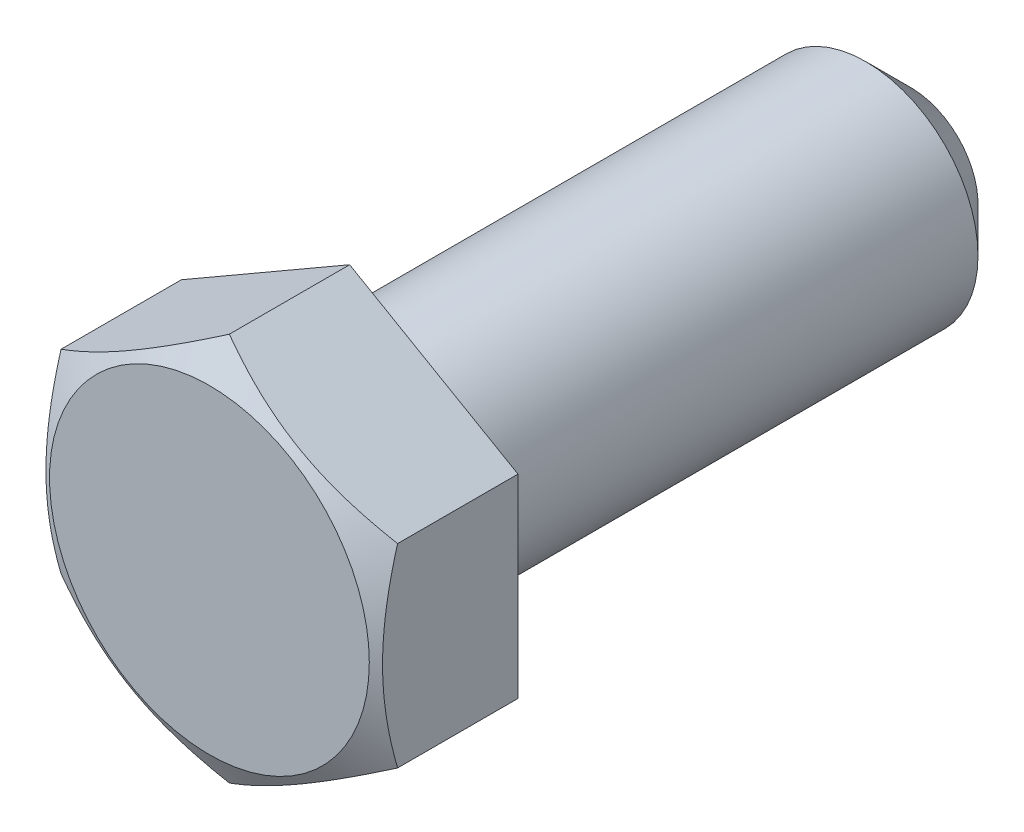
ISO-10303-21;
HEADER;
FILE_DESCRIPTION(('STEP AP214'),'2;1');
FILE_NAME('part.step','',(''),(''),'','','');
FILE_SCHEMA(('AUTOMOTIVE_DESIGN { 1 0 10303 214 1 1 1 1 }'));
ENDSEC;
DATA;
#1=APPLICATION_CONTEXT('core data for automotive mechanical design processes');
#2=APPLICATION_PROTOCOL_DEFINITION('international standard','automotive_design',2000,#1);
#3=PRODUCT_CONTEXT('',#1,'mechanical');
#4=PRODUCT('Part','Part','',(#3));
#5=PRODUCT_RELATED_PRODUCT_CATEGORY('part','',(#4));
#6=PRODUCT_DEFINITION_FORMATION('','',#4);
#7=PRODUCT_DEFINITION_CONTEXT('part definition',#1,'design');
#8=PRODUCT_DEFINITION('design','',#6,#7);
#9=PRODUCT_DEFINITION_SHAPE('','',#8);
#10=(LENGTH_UNIT() NAMED_UNIT(*) SI_UNIT(.MILLI.,.METRE.));
#11=(NAMED_UNIT(*) PLANE_ANGLE_UNIT() SI_UNIT($,.RADIAN.));
#12=(NAMED_UNIT(*) SI_UNIT($,.STERADIAN.) SOLID_ANGLE_UNIT());
#13=UNCERTAINTY_MEASURE_WITH_UNIT(LENGTH_MEASURE(1.E-05),#10,'distance_accuracy_value','');
#14=(GEOMETRIC_REPRESENTATION_CONTEXT(3) GLOBAL_UNCERTAINTY_ASSIGNED_CONTEXT((#13)) GLOBAL_UNIT_ASSIGNED_CONTEXT((#10,
#11,#12)) REPRESENTATION_CONTEXT('',''));
#15=CARTESIAN_POINT('',(0.,0.,0.));
#16=DIRECTION('',(0.,0.,1.));
#17=DIRECTION('',(1.,0.,0.));
#18=AXIS2_PLACEMENT_3D('',#15,#16,#17);
#19=CARTESIAN_POINT('',(-5.99999999999998,-3.46410161513775,5.));
#20=DIRECTION('',(0.5,0.866025403784439,0.));
#21=DIRECTION('',(-0.866025403784439,0.5,0.));
#22=AXIS2_PLACEMENT_3D('',#19,#20,#21);
#23=PLANE('',#22);
#24=CARTESIAN_POINT('',(-6.00019999999998,-3.46398614508391,4.29082986604757));
#25=CARTESIAN_POINT('',(-5.86831298517511,-3.54013114859567,4.3347859201272));
#26=CARTESIAN_POINT('',(-5.73593423148341,-3.61656005767456,4.37674711202273));
#27=CARTESIAN_POINT('',(-5.47010166371691,-3.77003856223392,4.45613034244834));
#28=CARTESIAN_POINT('',(-5.33664741215047,-3.8470884103003,4.49355042284748));
#29=CARTESIAN_POINT('',(-4.93414786853866,-4.07947163015328,4.59826450915695));
#30=CARTESIAN_POINT('',(-4.66351376704061,-4.23572230150507,4.65782486186122));
#31=CARTESIAN_POINT('',(-4.25851475367193,-4.46954859089501,4.72766670852789));
#32=CARTESIAN_POINT('',(-4.12535995126211,-4.54642555191021,4.7475626911913));
#33=CARTESIAN_POINT('',(-3.85844867807932,-4.70052684733204,4.78092550444416));
#34=CARTESIAN_POINT('',(-3.72469226152165,-4.77775115043745,4.79439290308425));
#35=CARTESIAN_POINT('',(-3.45694711123092,-4.93233388503202,4.81455532749276));
#36=CARTESIAN_POINT('',(-3.32295881481366,-5.00969206403678,4.82125803924327));
#37=CARTESIAN_POINT('',(-3.05486583404941,-5.16447561864887,4.827754555833));
#38=CARTESIAN_POINT('',(-2.92076115342572,-5.24190099210655,4.82754857409505));
#39=CARTESIAN_POINT('',(-2.55335498732316,-5.45402304100779,4.81748773401741));
#40=CARTESIAN_POINT('',(-2.32017376082349,-5.58865028489734,4.80059702624085));
#41=CARTESIAN_POINT('',(-1.85536008360595,-5.85701058656191,4.74703569645255));
#42=CARTESIAN_POINT('',(-1.62372926764809,-5.99074270050779,4.71034676627936));
#43=CARTESIAN_POINT('',(-1.15798010064802,-6.25964310745013,4.61863479254742));
#44=CARTESIAN_POINT('',(-0.923920520434874,-6.3947774690926,4.56322316253247));
#45=CARTESIAN_POINT('',(-0.459291913470387,-6.66303092039674,4.43746100605974));
#46=CARTESIAN_POINT('',(-0.228716936044308,-6.79615344568208,4.36714002192695));
#47=CARTESIAN_POINT('',(0.000200000000001147,-6.92831870032933,4.29082986604758));
#48=B_SPLINE_CURVE_WITH_KNOTS('',3,(#24,#25,#26,#27,#28,#29,#30,#31,#32,#33,#34,#35,#36,#37,#38,
#39,#40,#41,#42,#43,#44,#45,#46,#47),.UNSPECIFIED.,.F.,.F.,(4,2,2,2,2,2,2,2,2,2,2,4),(0.,
0.475482194578525,0.951168694392475,1.90451835622161,2.36951738073402,2.83447530880776,
3.29890435872166,3.76331906154277,4.57182194271093,5.38107376137306,6.20827406017202,
7.03385036012982),.UNSPECIFIED.);
#49=CARTESIAN_POINT('',(-5.99999999999998,-3.46410161513813,4.29089653438113));
#50=VERTEX_POINT('',#49);
#51=CARTESIAN_POINT('',(0.,-6.92820323027549,4.29089653438088));
#52=VERTEX_POINT('',#51);
#53=EDGE_CURVE('E98',#50,#52,#48,.T.);
#54=ORIENTED_EDGE('',*,*,#53,.F.);
#55=DIRECTION('',(0.,0.,-1.));
#56=VECTOR('',#55,1.);
#57=CARTESIAN_POINT('',(-5.99999999999998,-3.46410161513775,5.));
#58=LINE('',#57,#56);
#59=CARTESIAN_POINT('',(-5.99999999999998,-3.46410161513775,0.));
#60=VERTEX_POINT('',#59);
#61=EDGE_CURVE('E67',#50,#60,#58,.T.);
#62=ORIENTED_EDGE('',*,*,#61,.T.);
#63=DIRECTION('',(0.866025403784439,-0.5,0.));
#64=VECTOR('',#63,1.);
#65=CARTESIAN_POINT('',(-5.99999999999998,-3.46410161513775,0.));
#66=LINE('',#65,#64);
#67=CARTESIAN_POINT('',(0.,-6.92820323027549,0.));
#68=VERTEX_POINT('',#67);
#69=EDGE_CURVE('E106',#60,#68,#66,.T.);
#70=ORIENTED_EDGE('',*,*,#69,.T.);
#71=DIRECTION('',(0.,0.,-1.));
#72=VECTOR('',#71,1.);
#73=CARTESIAN_POINT('',(0.,-6.92820323027549,5.));
#74=LINE('',#73,#72);
#75=EDGE_CURVE('E105',#52,#68,#74,.T.);
#76=ORIENTED_EDGE('',*,*,#75,.F.);
#77=EDGE_LOOP('',(#54,#62,#70,#76));
#78=FACE_BOUND('',#77,.T.);
#79=ADVANCED_FACE('F44',(#78),#23,.F.);
#80=CARTESIAN_POINT('',(0.,-6.92820323027549,5.));
#81=DIRECTION('',(-0.5,0.866025403784439,0.));
#82=DIRECTION('',(-0.866025403784439,-0.5,0.));
#83=AXIS2_PLACEMENT_3D('',#80,#81,#82);
#84=PLANE('',#83);
#85=CARTESIAN_POINT('',(-0.000199999999999171,-6.92831870032933,4.29082986604758));
#86=CARTESIAN_POINT('',(0.131687014824876,-6.85217369681757,4.3347859201272));
#87=CARTESIAN_POINT('',(0.264065768516574,-6.77574478773868,4.37674711202273));
#88=CARTESIAN_POINT('',(0.529898336283079,-6.62226628317932,4.45613034244834));
#89=CARTESIAN_POINT('',(0.66335258784951,-6.54521643511294,4.49355042284748));
#90=CARTESIAN_POINT('',(1.06585213146133,-6.31283321525996,4.59826450915695));
#91=CARTESIAN_POINT('',(1.33648623295937,-6.15658254390817,4.65782486186122));
#92=CARTESIAN_POINT('',(1.74148524632806,-5.92275625451822,4.72766670852789));
#93=CARTESIAN_POINT('',(1.87464004873787,-5.84587929350303,4.7475626911913));
#94=CARTESIAN_POINT('',(2.14155132192066,-5.6917779980812,4.78092550444416));
#95=CARTESIAN_POINT('',(2.27530773847834,-5.61455369497578,4.79439290308425));
#96=CARTESIAN_POINT('',(2.54305288876907,-5.45997096038121,4.81455532749276));
#97=CARTESIAN_POINT('',(2.67704118518632,-5.38261278137645,4.82125803924327));
#98=CARTESIAN_POINT('',(2.94513416595058,-5.22782922676436,4.827754555833));
#99=CARTESIAN_POINT('',(3.07923884657426,-5.15040385330669,4.82754857409505));
#100=CARTESIAN_POINT('',(3.44664501267682,-4.93828180440545,4.81748773401741));
#101=CARTESIAN_POINT('',(3.67982623917649,-4.80365456051589,4.80059702624085));
#102=CARTESIAN_POINT('',(4.14463991639403,-4.53529425885133,4.74703569645255));
#103=CARTESIAN_POINT('',(4.37627073235189,-4.40156214490545,4.71034676627937));
#104=CARTESIAN_POINT('',(4.84201989935196,-4.13266173796311,4.61863479254742));
#105=CARTESIAN_POINT('',(5.07607947956511,-3.99752737632064,4.56322316253247));
#106=CARTESIAN_POINT('',(5.5407080865296,-3.72927392501649,4.43746100605974));
#107=CARTESIAN_POINT('',(5.77128306395568,-3.59615139973115,4.36714002192695));
#108=CARTESIAN_POINT('',(6.00019999999999,-3.46398614508391,4.29082986604758));
#109=B_SPLINE_CURVE_WITH_KNOTS('',3,(#85,#86,#87,#88,#89,#90,#91,#92,#93,#94,#95,#96,#97,#98,
#99,#100,#101,#102,#103,#104,#105,#106,#107,#108),.UNSPECIFIED.,.F.,.F.,(4,2,2,2,2,2,2,2,2,2,2,
4),(0.,0.475482194578524,0.951168694392474,1.90451835622161,2.36951738073402,2.83447530880775,
3.29890435872166,3.76331906154277,4.57182194271093,5.38107376137306,6.20827406017202,
7.03385036012982),.UNSPECIFIED.);
#110=CARTESIAN_POINT('',(5.99999999999999,-3.46410161513812,4.29089653438113));
#111=VERTEX_POINT('',#110);
#112=EDGE_CURVE('E107',#52,#111,#109,.T.);
#113=ORIENTED_EDGE('',*,*,#112,.F.);
#114=ORIENTED_EDGE('',*,*,#75,.T.);
#115=DIRECTION('',(0.866025403784439,0.5,0.));
#116=VECTOR('',#115,1.);
#117=CARTESIAN_POINT('',(0.,-6.92820323027549,0.));
#118=LINE('',#117,#116);
#119=CARTESIAN_POINT('',(5.99999999999999,-3.46410161513774,0.));
#120=VERTEX_POINT('',#119);
#121=EDGE_CURVE('E227',#68,#120,#118,.T.);
#122=ORIENTED_EDGE('',*,*,#121,.T.);
#123=DIRECTION('',(0.,0.,-1.));
#124=VECTOR('',#123,1.);
#125=CARTESIAN_POINT('',(5.99999999999999,-3.46410161513774,5.));
#126=LINE('',#125,#124);
#127=EDGE_CURVE('E124',#111,#120,#126,.T.);
#128=ORIENTED_EDGE('',*,*,#127,.F.);
#129=EDGE_LOOP('',(#113,#114,#122,#128));
#130=FACE_BOUND('',#129,.T.);
#131=ADVANCED_FACE('F140',(#130),#84,.F.);
#132=CARTESIAN_POINT('',(5.99999999999999,-3.46410161513774,5.));
#133=DIRECTION('',(-1.,0.,0.));
#134=DIRECTION('',(0.,-1.,0.));
#135=AXIS2_PLACEMENT_3D('',#132,#133,#134);
#136=PLANE('',#135);
#137=CARTESIAN_POINT('',(5.99999999999999,-9.41358703731059,1.84585655754542));
#138=CARTESIAN_POINT('',(5.99999999999999,-9.15055363254466,1.97388419446467));
#139=CARTESIAN_POINT('',(5.99999999999999,-8.88692786426045,2.10071510757524));
#140=CARTESIAN_POINT('',(5.99999999999999,-8.35817691182027,2.35131238753976));
#141=CARTESIAN_POINT('',(5.99999999999999,-8.09305150854343,2.47507829155208));
#142=CARTESIAN_POINT('',(5.99999999999999,-7.55967250710022,2.719473830938));
#143=CARTESIAN_POINT('',(5.99999999999999,-7.29140979810816,2.84008364922646));
#144=CARTESIAN_POINT('',(5.99999999999999,-6.7527878549826,3.07650919140131));
#145=CARTESIAN_POINT('',(5.99999999999999,-6.48242871758445,3.19232513494651));
#146=CARTESIAN_POINT('',(5.99999999999999,-5.93014019572464,3.42165597190256));
#147=CARTESIAN_POINT('',(5.99999999999999,-5.64812525483188,3.53496591554263));
#148=CARTESIAN_POINT('',(5.99999999999999,-5.08083631614906,3.75326995147352));
#149=CARTESIAN_POINT('',(5.99999999999999,-4.79556196274389,3.85826312626367));
#150=CARTESIAN_POINT('',(5.99999999999999,-4.22180070425094,4.05725759327078));
#151=CARTESIAN_POINT('',(5.99999999999999,-3.93332126545669,4.15128020625535));
#152=CARTESIAN_POINT('',(5.99999999999999,-3.3522227716447,4.32538790187895));
#153=CARTESIAN_POINT('',(5.99999999999999,-3.05960501611013,4.40547725908282));
#154=CARTESIAN_POINT('',(5.99999999999999,-2.4716777749085,4.54753070608564));
#155=CARTESIAN_POINT('',(5.99999999999999,-2.17639270662995,4.60959426766009));
#156=CARTESIAN_POINT('',(5.99999999999999,-1.58199809200649,4.71213678804348));
#157=CARTESIAN_POINT('',(5.99999999999998,-1.28288895916409,4.75261806070266));
#158=CARTESIAN_POINT('',(5.99999999999998,-0.834541803091241,4.79447047014564));
#159=CARTESIAN_POINT('',(5.99999999999998,-0.686147782785073,4.80526549063764));
#160=CARTESIAN_POINT('',(5.99999999999998,-0.389029437098239,4.82057075314271));
#161=CARTESIAN_POINT('',(5.99999999999998,-0.240305117413913,4.82508110271098));
#162=CARTESIAN_POINT('',(5.99999999999998,0.0572007852977071,4.82770224372379));
#163=CARTESIAN_POINT('',(5.99999999999998,0.205982368818301,4.82581297874654));
#164=CARTESIAN_POINT('',(5.99999999999998,0.503331383534949,4.81568408291935));
#165=CARTESIAN_POINT('',(5.99999999999998,0.651898804391681,4.8074441551235));
#166=CARTESIAN_POINT('',(5.99999999999998,1.00563279304975,4.78044117795031));
#167=CARTESIAN_POINT('',(5.99999999999998,1.21058824349711,4.75884951042692));
#168=CARTESIAN_POINT('',(5.99999999999998,1.61903955566245,4.70473232545167));
#169=CARTESIAN_POINT('',(5.99999999999998,1.82253522833311,4.67220541704672));
#170=CARTESIAN_POINT('',(5.99999999999998,2.43055789508273,4.55994161397375));
#171=CARTESIAN_POINT('',(5.99999999999998,2.8324163737843,4.46553934429469));
#172=CARTESIAN_POINT('',(5.99999999999998,3.4336102171109,4.30101298168707));
#173=CARTESIAN_POINT('',(5.99999999999998,3.63603903116757,4.24153593737795));
#174=CARTESIAN_POINT('',(5.99999999999998,4.03893185407426,4.11620342515447));
#175=CARTESIAN_POINT('',(5.99999999999998,4.23939584781033,4.0503479082174));
#176=CARTESIAN_POINT('',(5.99999999999998,4.63842099133087,3.91333183578959));
#177=CARTESIAN_POINT('',(5.99999999999998,4.83698267327765,3.84217281591573));
#178=CARTESIAN_POINT('',(5.99999999999998,5.23244486536281,3.69540716839134));
#179=CARTESIAN_POINT('',(5.99999999999998,5.42934541364145,3.61980064317681));
#180=CARTESIAN_POINT('',(5.99999999999998,5.96117877221294,3.40979298229923));
#181=CARTESIAN_POINT('',(5.99999999999998,6.29469803353771,3.27181544197228));
#182=CARTESIAN_POINT('',(5.99999999999998,6.95830015353404,2.98780148407034));
#183=CARTESIAN_POINT('',(5.99999999999998,7.28838262541143,2.8417641708147));
#184=CARTESIAN_POINT('',(5.99999999999998,7.94590538406068,2.54354833236395));
#185=CARTESIAN_POINT('',(5.99999999999998,8.27334460630883,2.39136746787091));
#186=CARTESIAN_POINT('',(5.99999999999998,8.92599053202563,2.08234112263793));
#187=CARTESIAN_POINT('',(5.99999999999998,9.2511973262104,1.92549583283746));
#188=CARTESIAN_POINT('',(5.99999999999998,9.90034398079229,1.60790609085145));
#189=CARTESIAN_POINT('',(5.99999999999998,10.2242809738719,1.44715579020985));
#190=CARTESIAN_POINT('',(5.99999999999998,10.8707018694697,1.12275778100802));
#191=CARTESIAN_POINT('',(5.99999999999998,11.1931857597844,0.95911004817129));
#192=CARTESIAN_POINT('',(5.99999999999998,11.8368897069848,0.629524847650664));
#193=CARTESIAN_POINT('',(5.99999999999998,12.158110028133,0.463587895477902));
#194=CARTESIAN_POINT('',(5.99999999999998,12.7995648774071,0.129818380667889));
#195=CARTESIAN_POINT('',(5.99999999999998,13.1197994016347,-0.0380141894534051));
#196=CARTESIAN_POINT('',(5.99999999999998,14.0112683584179,-0.507987875400701));
#197=CARTESIAN_POINT('',(5.99999999999998,14.581604569695,-0.811832408940193));
#198=CARTESIAN_POINT('',(5.99999999999998,15.7203829945989,-1.4231263706597));
#199=CARTESIAN_POINT('',(5.99999999999998,16.2888250887529,-1.73057602090755));
#200=CARTESIAN_POINT('',(5.99999999999998,17.4223575049369,-2.34712293809246));
#201=CARTESIAN_POINT('',(5.99999999999998,17.9874526823461,-2.65621128700788));
#202=CARTESIAN_POINT('',(5.99999999999998,19.1164595496422,-3.27643769650407));
#203=CARTESIAN_POINT('',(5.99999999999998,19.6803713293078,-3.58757559359287));
#204=CARTESIAN_POINT('',(5.99999999999998,20.2438682595685,-3.89945760472932));
#205=B_SPLINE_CURVE_WITH_KNOTS('',3,(#137,#138,#139,#140,#141,#142,#143,#144,#145,#146,#147,
#148,#149,#150,#151,#152,#153,#154,#155,#156,#157,#158,#159,#160,#161,#162,#163,#164,#165,#166,
#167,#168,#169,#170,#171,#172,#173,#174,#175,#176,#177,#178,#179,#180,#181,#182,#183,#184,#185,
#186,#187,#188,#189,#190,#191,#192,#193,#194,#195,#196,#197,#198,#199,#200,#201,#202,#203,#204),
.UNSPECIFIED.,.F.,.F.,(4,2,2,2,2,2,2,2,2,2,2,2,2,2,2,2,2,2,2,2,2,2,2,2,2,2,2,2,2,2,2,2,2,4),(0.,
0.877619945655784,1.75537162086165,2.63771968983467,3.52002728412377,4.43170670364811,
5.34348655940047,6.25346381046229,7.16316139662659,8.06773922845909,8.97222006044406,
9.4184656664961,9.86470363545433,10.3109455386519,10.7572083086089,11.3751306474366,
11.9931316152031,13.2297455640911,13.862646599359,14.4955524992686,15.1282758494222,
15.7609846322435,16.8436256728654,17.9263872703455,19.0095651164115,20.0926986831795,
21.1775688733815,22.2624481576138,23.3470870005804,24.4317301272812,26.3703807477041,
28.3091514190111,30.2414543528364,32.1736049701543),.UNSPECIFIED.);
#206=CARTESIAN_POINT('',(5.99999999999998,3.46410161513775,4.29089653438088));
#207=VERTEX_POINT('',#206);
#208=EDGE_CURVE('E195',#111,#207,#205,.T.);
#209=ORIENTED_EDGE('',*,*,#208,.F.);
#210=ORIENTED_EDGE('',*,*,#127,.T.);
#211=DIRECTION('',(0.,1.,0.));
#212=VECTOR('',#211,1.);
#213=CARTESIAN_POINT('',(5.99999999999999,-3.46410161513774,0.));
#214=LINE('',#213,#212);
#215=CARTESIAN_POINT('',(5.99999999999998,3.46410161513775,0.));
#216=VERTEX_POINT('',#215);
#217=EDGE_CURVE('E228',#120,#216,#214,.T.);
#218=ORIENTED_EDGE('',*,*,#217,.T.);
#219=DIRECTION('',(0.,0.,-1.));
#220=VECTOR('',#219,1.);
#221=CARTESIAN_POINT('',(5.99999999999998,3.46410161513775,5.));
#222=LINE('',#221,#220);
#223=EDGE_CURVE('E122',#207,#216,#222,.T.);
#224=ORIENTED_EDGE('',*,*,#223,.F.);
#225=EDGE_LOOP('',(#209,#210,#218,#224));
#226=FACE_BOUND('',#225,.T.);
#227=ADVANCED_FACE('F144',(#226),#136,.F.);
#228=CARTESIAN_POINT('',(5.99999999999998,3.46410161513775,5.));
#229=DIRECTION('',(-0.5,-0.866025403784439,0.));
#230=DIRECTION('',(0.866025403784439,-0.5,0.));
#231=AXIS2_PLACEMENT_3D('',#228,#229,#230);
#232=PLANE('',#231);
#233=CARTESIAN_POINT('',(6.00019999999998,3.46398614508391,4.29082986604758));
#234=CARTESIAN_POINT('',(5.86831298517511,3.54013114859567,4.3347859201272));
#235=CARTESIAN_POINT('',(5.73593423148341,3.61656005767455,4.37674711202273));
#236=CARTESIAN_POINT('',(5.4701016637169,3.77003856223392,4.45613034244834));
#237=CARTESIAN_POINT('',(5.33664741215047,3.8470884103003,4.49355042284748));
#238=CARTESIAN_POINT('',(4.93414786853866,4.07947163015328,4.59826450915695));
#239=CARTESIAN_POINT('',(4.66351376704061,4.23572230150507,4.65782486186122));
#240=CARTESIAN_POINT('',(4.25851475367193,4.46954859089501,4.72766670852789));
#241=CARTESIAN_POINT('',(4.12535995126211,4.54642555191021,4.7475626911913));
#242=CARTESIAN_POINT('',(3.85844867807933,4.70052684733204,4.78092550444416));
#243=CARTESIAN_POINT('',(3.72469226152165,4.77775115043745,4.79439290308425));
#244=CARTESIAN_POINT('',(3.45694711123092,4.93233388503202,4.81455532749276));
#245=CARTESIAN_POINT('',(3.32295881481366,5.00969206403678,4.82125803924327));
#246=CARTESIAN_POINT('',(3.05486583404941,5.16447561864887,4.827754555833));
#247=CARTESIAN_POINT('',(2.92076115342572,5.24190099210655,4.82754857409505));
#248=CARTESIAN_POINT('',(2.55335498732316,5.45402304100779,4.81748773401741));
#249=CARTESIAN_POINT('',(2.32017376082349,5.58865028489734,4.80059702624085));
#250=CARTESIAN_POINT('',(1.85536008360595,5.85701058656191,4.74703569645255));
#251=CARTESIAN_POINT('',(1.62372926764809,5.99074270050779,4.71034676627936));
#252=CARTESIAN_POINT('',(1.15798010064802,6.25964310745012,4.61863479254742));
#253=CARTESIAN_POINT('',(0.923920520434875,6.3947774690926,4.56322316253247));
#254=CARTESIAN_POINT('',(0.459291913470389,6.66303092039674,4.43746100605974));
#255=CARTESIAN_POINT('',(0.228716936044308,6.79615344568208,4.36714002192695));
#256=CARTESIAN_POINT('',(-0.000200000000000306,6.92831870032933,4.29082986604758));
#257=B_SPLINE_CURVE_WITH_KNOTS('',3,(#233,#234,#235,#236,#237,#238,#239,#240,#241,#242,#243,
#244,#245,#246,#247,#248,#249,#250,#251,#252,#253,#254,#255,#256),.UNSPECIFIED.,.F.,.F.,(4,2,2,
2,2,2,2,2,2,2,2,4),(0.,0.475482194578526,0.951168694392475,1.90451835622161,2.36951738073401,
2.83447530880775,3.29890435872166,3.76331906154277,4.57182194271093,5.38107376137306,
6.20827406017202,7.03385036012981),.UNSPECIFIED.);
#258=CARTESIAN_POINT('',(0.,6.92820323027549,4.29089653438088));
#259=VERTEX_POINT('',#258);
#260=EDGE_CURVE('E189',#207,#259,#257,.T.);
#261=ORIENTED_EDGE('',*,*,#260,.F.);
#262=ORIENTED_EDGE('',*,*,#223,.T.);
#263=DIRECTION('',(-0.866025403784439,0.5,0.));
#264=VECTOR('',#263,1.);
#265=CARTESIAN_POINT('',(5.99999999999998,3.46410161513775,0.));
#266=LINE('',#265,#264);
#267=CARTESIAN_POINT('',(0.,6.92820323027549,0.));
#268=VERTEX_POINT('',#267);
#269=EDGE_CURVE('E231',#216,#268,#266,.T.);
#270=ORIENTED_EDGE('',*,*,#269,.T.);
#271=DIRECTION('',(0.,0.,-1.));
#272=VECTOR('',#271,1.);
#273=CARTESIAN_POINT('',(0.,6.92820323027549,5.));
#274=LINE('',#273,#272);
#275=EDGE_CURVE('E115',#259,#268,#274,.T.);
#276=ORIENTED_EDGE('',*,*,#275,.F.);
#277=EDGE_LOOP('',(#261,#262,#270,#276));
#278=FACE_BOUND('',#277,.T.);
#279=ADVANCED_FACE('F202',(#278),#232,.F.);
#280=CARTESIAN_POINT('',(0.,6.92820323027549,5.));
#281=DIRECTION('',(0.5,-0.866025403784439,0.));
#282=DIRECTION('',(0.866025403784439,0.5,0.));
#283=AXIS2_PLACEMENT_3D('',#280,#281,#282);
#284=PLANE('',#283);
#285=CARTESIAN_POINT('',(0.000199999999999921,6.92831870032933,4.29082986604758));
#286=CARTESIAN_POINT('',(-0.131687014824875,6.85217369681757,4.3347859201272));
#287=CARTESIAN_POINT('',(-0.264065768516573,6.77574478773868,4.37674711202273));
#288=CARTESIAN_POINT('',(-0.529898336283078,6.62226628317932,4.45613034244834));
#289=CARTESIAN_POINT('',(-0.663352587849509,6.54521643511294,4.49355042284748));
#290=CARTESIAN_POINT('',(-1.06585213146133,6.31283321525996,4.59826450915695));
#291=CARTESIAN_POINT('',(-1.33648623295937,6.15658254390817,4.65782486186122));
#292=CARTESIAN_POINT('',(-1.74148524632806,5.92275625451822,4.72766670852789));
#293=CARTESIAN_POINT('',(-1.87464004873787,5.84587929350302,4.7475626911913));
#294=CARTESIAN_POINT('',(-2.14155132192066,5.6917779980812,4.78092550444416));
#295=CARTESIAN_POINT('',(-2.27530773847833,5.61455369497578,4.79439290308425));
#296=CARTESIAN_POINT('',(-2.54305288876907,5.45997096038121,4.81455532749276));
#297=CARTESIAN_POINT('',(-2.67704118518632,5.38261278137645,4.82125803924327));
#298=CARTESIAN_POINT('',(-2.94513416595057,5.22782922676436,4.827754555833));
#299=CARTESIAN_POINT('',(-3.07923884657426,5.15040385330669,4.82754857409505));
#300=CARTESIAN_POINT('',(-3.44664501267682,4.93828180440545,4.81748773401741));
#301=CARTESIAN_POINT('',(-3.67982623917649,4.80365456051589,4.80059702624085));
#302=CARTESIAN_POINT('',(-4.14463991639403,4.53529425885133,4.74703569645255));
#303=CARTESIAN_POINT('',(-4.37627073235189,4.40156214490545,4.71034676627937));
#304=CARTESIAN_POINT('',(-4.84201989935196,4.13266173796311,4.61863479254742));
#305=CARTESIAN_POINT('',(-5.07607947956511,3.99752737632064,4.56322316253247));
#306=CARTESIAN_POINT('',(-5.54070808652959,3.72927392501649,4.43746100605974));
#307=CARTESIAN_POINT('',(-5.77128306395567,3.59615139973115,4.36714002192695));
#308=CARTESIAN_POINT('',(-6.00019999999998,3.46398614508391,4.29082986604758));
#309=B_SPLINE_CURVE_WITH_KNOTS('',3,(#285,#286,#287,#288,#289,#290,#291,#292,#293,#294,#295,
#296,#297,#298,#299,#300,#301,#302,#303,#304,#305,#306,#307,#308),.UNSPECIFIED.,.F.,.F.,(4,2,2,
2,2,2,2,2,2,2,2,4),(0.,0.475482194578524,0.951168694392474,1.90451835622161,2.36951738073402,
2.83447530880775,3.29890435872166,3.76331906154277,4.57182194271093,5.38107376137306,
6.20827406017202,7.03385036012982),.UNSPECIFIED.);
#310=CARTESIAN_POINT('',(-5.99999999999998,3.46410161513774,4.29089653438088));
#311=VERTEX_POINT('',#310);
#312=EDGE_CURVE('E59',#259,#311,#309,.T.);
#313=ORIENTED_EDGE('',*,*,#312,.F.);
#314=ORIENTED_EDGE('',*,*,#275,.T.);
#315=DIRECTION('',(-0.866025403784439,-0.5,0.));
#316=VECTOR('',#315,1.);
#317=CARTESIAN_POINT('',(0.,6.92820323027549,0.));
#318=LINE('',#317,#316);
#319=CARTESIAN_POINT('',(-5.99999999999998,3.46410161513774,0.));
#320=VERTEX_POINT('',#319);
#321=EDGE_CURVE('E117',#268,#320,#318,.T.);
#322=ORIENTED_EDGE('',*,*,#321,.T.);
#323=DIRECTION('',(0.,0.,-1.));
#324=VECTOR('',#323,1.);
#325=CARTESIAN_POINT('',(-5.99999999999998,3.46410161513774,5.));
#326=LINE('',#325,#324);
#327=EDGE_CURVE('E113',#311,#320,#326,.T.);
#328=ORIENTED_EDGE('',*,*,#327,.F.);
#329=EDGE_LOOP('',(#313,#314,#322,#328));
#330=FACE_BOUND('',#329,.T.);
#331=ADVANCED_FACE('F206',(#330),#284,.F.);
#332=CARTESIAN_POINT('',(-5.99999999999998,3.46410161513774,5.));
#333=DIRECTION('',(1.,0.,0.));
#334=DIRECTION('',(0.,1.,0.));
#335=AXIS2_PLACEMENT_3D('',#332,#333,#334);
#336=PLANE('',#335);
#337=CARTESIAN_POINT('',(-5.99999999999999,-9.41358703731059,1.84585655754542));
#338=CARTESIAN_POINT('',(-5.99999999999999,-9.15055363254466,1.97388419446467));
#339=CARTESIAN_POINT('',(-5.99999999999999,-8.88692786426045,2.10071510757524));
#340=CARTESIAN_POINT('',(-5.99999999999999,-8.35817691182027,2.35131238753976));
#341=CARTESIAN_POINT('',(-5.99999999999999,-8.09305150854343,2.47507829155208));
#342=CARTESIAN_POINT('',(-5.99999999999999,-7.55967250710022,2.719473830938));
#343=CARTESIAN_POINT('',(-5.99999999999999,-7.29140979810816,2.84008364922646));
#344=CARTESIAN_POINT('',(-5.99999999999999,-6.7527878549826,3.07650919140131));
#345=CARTESIAN_POINT('',(-5.99999999999998,-6.48242871758445,3.19232513494651));
#346=CARTESIAN_POINT('',(-5.99999999999998,-5.93014019572464,3.42165597190256));
#347=CARTESIAN_POINT('',(-5.99999999999998,-5.64812525483188,3.53496591554263));
#348=CARTESIAN_POINT('',(-5.99999999999998,-5.08083631614907,3.75326995147352));
#349=CARTESIAN_POINT('',(-5.99999999999998,-4.7955619627439,3.85826312626367));
#350=CARTESIAN_POINT('',(-5.99999999999998,-4.22180070425095,4.05725759327078));
#351=CARTESIAN_POINT('',(-5.99999999999998,-3.93332126545669,4.15128020625535));
#352=CARTESIAN_POINT('',(-5.99999999999998,-3.3522227716447,4.32538790187895));
#353=CARTESIAN_POINT('',(-5.99999999999998,-3.05960501611013,4.40547725908282));
#354=CARTESIAN_POINT('',(-5.99999999999998,-2.4716777749085,4.54753070608564));
#355=CARTESIAN_POINT('',(-5.99999999999998,-2.17639270662995,4.60959426766009));
#356=CARTESIAN_POINT('',(-5.99999999999998,-1.58199809200649,4.71213678804348));
#357=CARTESIAN_POINT('',(-5.99999999999998,-1.28288895916409,4.75261806070266));
#358=CARTESIAN_POINT('',(-5.99999999999998,-0.834541803091243,4.79447047014564));
#359=CARTESIAN_POINT('',(-5.99999999999998,-0.686147782785074,4.80526549063764));
#360=CARTESIAN_POINT('',(-5.99999999999998,-0.389029437098241,4.82057075314271));
#361=CARTESIAN_POINT('',(-5.99999999999998,-0.240305117413915,4.82508110271098));
#362=CARTESIAN_POINT('',(-5.99999999999998,0.0572007852977055,4.82770224372379));
#363=CARTESIAN_POINT('',(-5.99999999999998,0.205982368818299,4.82581297874654));
#364=CARTESIAN_POINT('',(-5.99999999999998,0.503331383534947,4.81568408291935));
#365=CARTESIAN_POINT('',(-5.99999999999998,0.651898804391679,4.8074441551235));
#366=CARTESIAN_POINT('',(-5.99999999999998,1.00563279304974,4.78044117795031));
#367=CARTESIAN_POINT('',(-5.99999999999998,1.21058824349711,4.75884951042692));
#368=CARTESIAN_POINT('',(-5.99999999999998,1.61903955566245,4.70473232545167));
#369=CARTESIAN_POINT('',(-5.99999999999998,1.82253522833311,4.67220541704672));
#370=CARTESIAN_POINT('',(-5.99999999999998,2.43055789508272,4.55994161397375));
#371=CARTESIAN_POINT('',(-5.99999999999998,2.8324163737843,4.46553934429469));
#372=CARTESIAN_POINT('',(-5.99999999999998,3.4336102171109,4.30101298168707));
#373=CARTESIAN_POINT('',(-5.99999999999998,3.63603903116757,4.24153593737795));
#374=CARTESIAN_POINT('',(-5.99999999999998,4.03893185407426,4.11620342515447));
#375=CARTESIAN_POINT('',(-5.99999999999998,4.23939584781032,4.0503479082174));
#376=CARTESIAN_POINT('',(-5.99999999999998,4.63842099133087,3.91333183578959));
#377=CARTESIAN_POINT('',(-5.99999999999998,4.83698267327765,3.84217281591573));
#378=CARTESIAN_POINT('',(-5.99999999999998,5.2324448653628,3.69540716839134));
#379=CARTESIAN_POINT('',(-5.99999999999998,5.42934541364145,3.61980064317681));
#380=CARTESIAN_POINT('',(-5.99999999999998,5.96117877221294,3.40979298229923));
#381=CARTESIAN_POINT('',(-5.99999999999998,6.29469803353771,3.27181544197228));
#382=CARTESIAN_POINT('',(-5.99999999999998,6.95830015353403,2.98780148407035));
#383=CARTESIAN_POINT('',(-5.99999999999998,7.28838262541142,2.8417641708147));
#384=CARTESIAN_POINT('',(-5.99999999999998,7.94590538406068,2.54354833236396));
#385=CARTESIAN_POINT('',(-5.99999999999998,8.27334460630882,2.39136746787091));
#386=CARTESIAN_POINT('',(-5.99999999999998,8.92599053202563,2.08234112263794));
#387=CARTESIAN_POINT('',(-5.99999999999998,9.25119732621039,1.92549583283746));
#388=CARTESIAN_POINT('',(-5.99999999999998,9.90034398079229,1.60790609085146));
#389=CARTESIAN_POINT('',(-5.99999999999998,10.2242809738719,1.44715579020985));
#390=CARTESIAN_POINT('',(-5.99999999999998,10.8707018694697,1.12275778100802));
#391=CARTESIAN_POINT('',(-5.99999999999998,11.1931857597844,0.959110048171292));
#392=CARTESIAN_POINT('',(-5.99999999999998,11.8368897069848,0.629524847650664));
#393=CARTESIAN_POINT('',(-5.99999999999998,12.158110028133,0.463587895477903));
#394=CARTESIAN_POINT('',(-5.99999999999998,12.7995648774071,0.12981838066789));
#395=CARTESIAN_POINT('',(-5.99999999999998,13.1197994016347,-0.0380141894534047));
#396=CARTESIAN_POINT('',(-5.99999999999998,14.0112683584179,-0.5079878754007));
#397=CARTESIAN_POINT('',(-5.99999999999998,14.581604569695,-0.811832408940191));
#398=CARTESIAN_POINT('',(-5.99999999999998,15.7203829945989,-1.4231263706597));
#399=CARTESIAN_POINT('',(-5.99999999999998,16.2888250887529,-1.73057602090755));
#400=CARTESIAN_POINT('',(-5.99999999999998,17.4223575049369,-2.34712293809246));
#401=CARTESIAN_POINT('',(-5.99999999999998,17.9874526823461,-2.65621128700788));
#402=CARTESIAN_POINT('',(-5.99999999999998,19.1164595496422,-3.27643769650407));
#403=CARTESIAN_POINT('',(-5.99999999999998,19.6803713293078,-3.58757559359287));
#404=CARTESIAN_POINT('',(-5.99999999999998,20.2438682595685,-3.89945760472931));
#405=B_SPLINE_CURVE_WITH_KNOTS('',3,(#337,#338,#339,#340,#341,#342,#343,#344,#345,#346,#347,
#348,#349,#350,#351,#352,#353,#354,#355,#356,#357,#358,#359,#360,#361,#362,#363,#364,#365,#366,
#367,#368,#369,#370,#371,#372,#373,#374,#375,#376,#377,#378,#379,#380,#381,#382,#383,#384,#385,
#386,#387,#388,#389,#390,#391,#392,#393,#394,#395,#396,#397,#398,#399,#400,#401,#402,#403,#404),
.UNSPECIFIED.,.F.,.F.,(4,2,2,2,2,2,2,2,2,2,2,2,2,2,2,2,2,2,2,2,2,2,2,2,2,2,2,2,2,2,2,2,2,4),(0.,
0.877619945655783,1.75537162086165,2.63771968983467,3.52002728412377,4.43170670364811,
5.34348655940047,6.25346381046229,7.16316139662659,8.06773922845909,8.97222006044406,
9.4184656664961,9.86470363545434,10.3109455386519,10.7572083086089,11.3751306474366,
11.9931316152031,13.2297455640911,13.862646599359,14.4955524992686,15.1282758494222,
15.7609846322435,16.8436256728653,17.9263872703455,19.0095651164115,20.0926986831795,
21.1775688733815,22.2624481576138,23.3470870005804,24.4317301272812,26.3703807477041,
28.3091514190112,30.2414543528364,32.1736049701543),.UNSPECIFIED.);
#406=EDGE_CURVE('E96',#311,#50,#405,.F.);
#407=ORIENTED_EDGE('',*,*,#406,.F.);
#408=ORIENTED_EDGE('',*,*,#327,.T.);
#409=DIRECTION('',(0.,-1.,0.));
#410=VECTOR('',#409,1.);
#411=CARTESIAN_POINT('',(-5.99999999999998,3.46410161513774,0.));
#412=LINE('',#411,#410);
#413=EDGE_CURVE('E111',#320,#60,#412,.T.);
#414=ORIENTED_EDGE('',*,*,#413,.T.);
#415=ORIENTED_EDGE('',*,*,#61,.F.);
#416=EDGE_LOOP('',(#407,#408,#414,#415));
#417=FACE_BOUND('',#416,.T.);
#418=ADVANCED_FACE('F109',(#417),#336,.F.);
#419=CARTESIAN_POINT('',(-5.99999999999998,-3.46410161513774,0.));
#420=DIRECTION('',(0.,0.,-1.));
#421=DIRECTION('',(-1.,0.,0.));
#422=AXIS2_PLACEMENT_3D('',#419,#420,#421);
#423=PLANE('',#422);
#424=CARTESIAN_POINT('',(0.,0.,0.));
#425=DIRECTION('',(0.,0.,-1.));
#426=DIRECTION('',(-1.,0.,0.));
#427=AXIS2_PLACEMENT_3D('',#424,#425,#426);
#428=CIRCLE('',#427,4.);
#429=CARTESIAN_POINT('',(-4.,0.,0.));
#430=VERTEX_POINT('',#429);
#431=EDGE_CURVE('E222',#430,#430,#428,.T.);
#432=ORIENTED_EDGE('',*,*,#431,.F.);
#433=EDGE_LOOP('',(#432));
#434=FACE_BOUND('',#433,.T.);
#435=ORIENTED_EDGE('',*,*,#69,.F.);
#436=ORIENTED_EDGE('',*,*,#413,.F.);
#437=ORIENTED_EDGE('',*,*,#321,.F.);
#438=ORIENTED_EDGE('',*,*,#269,.F.);
#439=ORIENTED_EDGE('',*,*,#217,.F.);
#440=ORIENTED_EDGE('',*,*,#121,.F.);
#441=EDGE_LOOP('',(#435,#436,#437,#438,#439,#440));
#442=FACE_BOUND('',#441,.T.);
#443=ADVANCED_FACE('F168',(#434,#442),#423,.T.);
#444=CARTESIAN_POINT('',(0.,0.,5.));
#445=DIRECTION('',(0.,0.,-1.));
#446=DIRECTION('',(1.,0.,0.));
#447=AXIS2_PLACEMENT_3D('',#444,#445,#446);
#448=CONICAL_SURFACE('',#447,5.7,1.0471975511966);
#449=CARTESIAN_POINT('',(0.,0.,5.));
#450=DIRECTION('',(0.,0.,1.));
#451=DIRECTION('',(1.,0.,0.));
#452=AXIS2_PLACEMENT_3D('',#449,#450,#451);
#453=CIRCLE('',#452,5.7);
#454=CARTESIAN_POINT('',(5.7,0.,5.));
#455=VERTEX_POINT('',#454);
#456=EDGE_CURVE('E102',#455,#455,#453,.T.);
#457=ORIENTED_EDGE('',*,*,#456,.F.);
#458=EDGE_LOOP('',(#457));
#459=FACE_BOUND('',#458,.T.);
#460=ORIENTED_EDGE('',*,*,#53,.T.);
#461=ORIENTED_EDGE('',*,*,#112,.T.);
#462=ORIENTED_EDGE('',*,*,#208,.T.);
#463=ORIENTED_EDGE('',*,*,#260,.T.);
#464=ORIENTED_EDGE('',*,*,#312,.T.);
#465=ORIENTED_EDGE('',*,*,#406,.T.);
#466=EDGE_LOOP('',(#460,#461,#462,#463,#464,#465));
#467=FACE_BOUND('',#466,.T.);
#468=ADVANCED_FACE('F97',(#459,#467),#448,.T.);
#469=CARTESIAN_POINT('',(-5.99999999999998,-3.46410161513774,5.));
#470=DIRECTION('',(0.,0.,-1.));
#471=DIRECTION('',(-1.,0.,0.));
#472=AXIS2_PLACEMENT_3D('',#469,#470,#471);
#473=PLANE('',#472);
#474=ORIENTED_EDGE('',*,*,#456,.T.);
#475=EDGE_LOOP('',(#474));
#476=FACE_BOUND('',#475,.T.);
#477=ADVANCED_FACE('F167',(#476),#473,.F.);
#478=CARTESIAN_POINT('',(0.,0.,-20.));
#479=DIRECTION('',(0.,0.,1.));
#480=DIRECTION('',(1.,0.,0.));
#481=AXIS2_PLACEMENT_3D('',#478,#479,#480);
#482=CYLINDRICAL_SURFACE('',#481,4.);
#483=CARTESIAN_POINT('',(0.,0.,-18.4));
#484=DIRECTION('',(0.,0.,-1.));
#485=DIRECTION('',(-1.,0.,0.));
#486=AXIS2_PLACEMENT_3D('',#483,#484,#485);
#487=CIRCLE('',#486,4.);
#488=CARTESIAN_POINT('',(-4.,0.,-18.4));
#489=VERTEX_POINT('',#488);
#490=EDGE_CURVE('E12',#489,#489,#487,.F.);
#491=ORIENTED_EDGE('',*,*,#490,.T.);
#492=EDGE_LOOP('',(#491));
#493=FACE_BOUND('',#492,.T.);
#494=ORIENTED_EDGE('',*,*,#431,.T.);
#495=EDGE_LOOP('',(#494));
#496=FACE_BOUND('',#495,.T.);
#497=ADVANCED_FACE('F136',(#493,#496),#482,.T.);
#498=CARTESIAN_POINT('',(0.,0.,-20.));
#499=DIRECTION('',(0.,0.,-1.));
#500=DIRECTION('',(-1.,0.,0.));
#501=AXIS2_PLACEMENT_3D('',#498,#499,#500);
#502=PLANE('',#501);
#503=CARTESIAN_POINT('',(0.,0.,-20.));
#504=DIRECTION('',(0.,0.,-1.));
#505=DIRECTION('',(-1.,0.,0.));
#506=AXIS2_PLACEMENT_3D('',#503,#504,#505);
#507=CIRCLE('',#506,2.4);
#508=CARTESIAN_POINT('',(-2.4,0.,-20.));
#509=VERTEX_POINT('',#508);
#510=EDGE_CURVE('E52',#509,#509,#507,.T.);
#511=ORIENTED_EDGE('',*,*,#510,.T.);
#512=EDGE_LOOP('',(#511));
#513=FACE_BOUND('',#512,.T.);
#514=ADVANCED_FACE('F129',(#513),#502,.T.);
#515=CARTESIAN_POINT('',(0.,0.,-20.));
#516=DIRECTION('',(0.,0.,1.));
#517=DIRECTION('',(1.,0.,0.));
#518=AXIS2_PLACEMENT_3D('',#515,#516,#517);
#519=CONICAL_SURFACE('',#518,2.4,0.785398163397448);
#520=ORIENTED_EDGE('',*,*,#490,.F.);
#521=EDGE_LOOP('',(#520));
#522=FACE_BOUND('',#521,.T.);
#523=ORIENTED_EDGE('',*,*,#510,.F.);
#524=EDGE_LOOP('',(#523));
#525=FACE_BOUND('',#524,.T.);
#526=ADVANCED_FACE('F46',(#522,#525),#519,.T.);
#527=CLOSED_SHELL('',(#79,#131,#227,#279,#331,#418,#443,#468,#477,#497,#514,#526));
#528=MANIFOLD_SOLID_BREP('B2',#527);
#529=ADVANCED_BREP_SHAPE_REPRESENTATION('',(#18,#528),#14);
#530=SHAPE_DEFINITION_REPRESENTATION(#9,#529);
ENDSEC;
END-ISO-10303-21;
